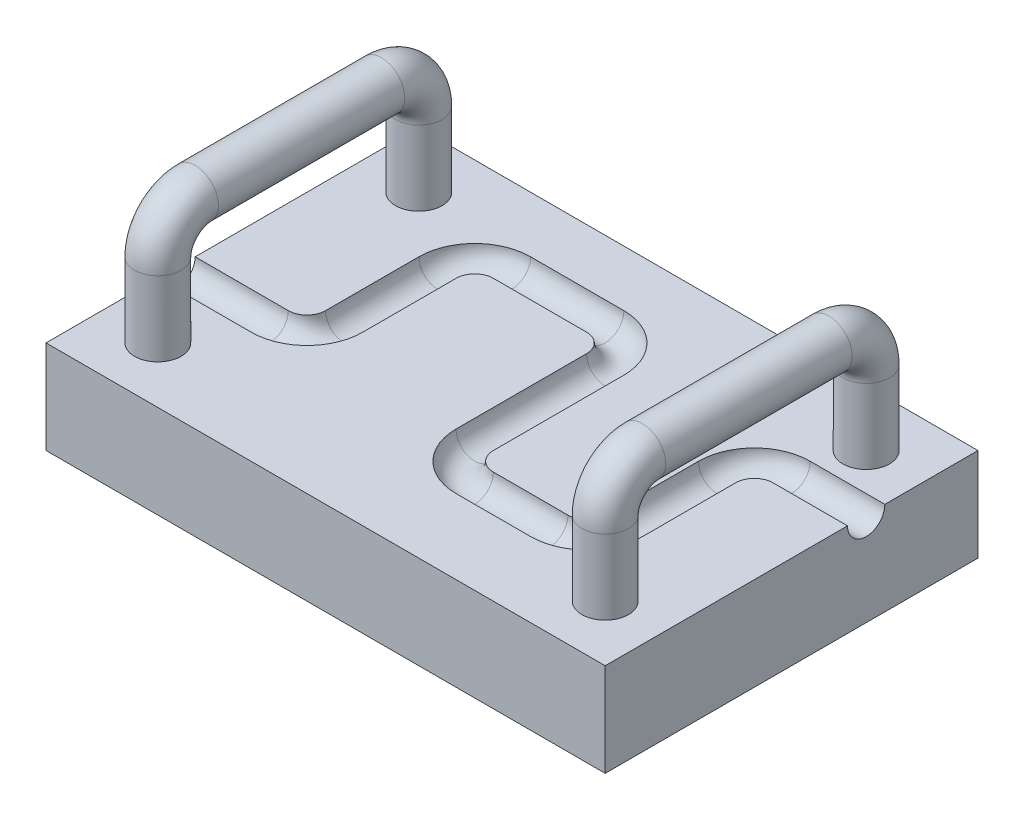
ISO-10303-21;
HEADER;
FILE_DESCRIPTION(('STEP AP214'),'2;1');
FILE_NAME('part.step','',(''),(''),'','','');
FILE_SCHEMA(('AUTOMOTIVE_DESIGN { 1 0 10303 214 1 1 1 1 }'));
ENDSEC;
DATA;
#1=APPLICATION_CONTEXT('core data for automotive mechanical design processes');
#2=APPLICATION_PROTOCOL_DEFINITION('international standard','automotive_design',2000,#1);
#3=PRODUCT_CONTEXT('',#1,'mechanical');
#4=PRODUCT('Part','Part','',(#3));
#5=PRODUCT_RELATED_PRODUCT_CATEGORY('part','',(#4));
#6=PRODUCT_DEFINITION_FORMATION('','',#4);
#7=PRODUCT_DEFINITION_CONTEXT('part definition',#1,'design');
#8=PRODUCT_DEFINITION('design','',#6,#7);
#9=PRODUCT_DEFINITION_SHAPE('','',#8);
#10=(LENGTH_UNIT() NAMED_UNIT(*) SI_UNIT(.MILLI.,.METRE.));
#11=(NAMED_UNIT(*) PLANE_ANGLE_UNIT() SI_UNIT($,.RADIAN.));
#12=(NAMED_UNIT(*) SI_UNIT($,.STERADIAN.) SOLID_ANGLE_UNIT());
#13=UNCERTAINTY_MEASURE_WITH_UNIT(LENGTH_MEASURE(1.E-05),#10,'distance_accuracy_value','');
#14=(GEOMETRIC_REPRESENTATION_CONTEXT(3) GLOBAL_UNCERTAINTY_ASSIGNED_CONTEXT((#13)) GLOBAL_UNIT_ASSIGNED_CONTEXT((#10,
#11,#12)) REPRESENTATION_CONTEXT('',''));
#15=CARTESIAN_POINT('',(0.,0.,0.));
#16=DIRECTION('',(0.,0.,1.));
#17=DIRECTION('',(1.,0.,0.));
#18=AXIS2_PLACEMENT_3D('',#15,#16,#17);
#19=CARTESIAN_POINT('',(0.,50.,0.));
#20=DIRECTION('',(0.,-1.,0.));
#21=DIRECTION('',(0.,0.,-1.));
#22=AXIS2_PLACEMENT_3D('',#19,#20,#21);
#23=PLANE('',#22);
#24=CARTESIAN_POINT('',(120.,50.,70.));
#25=DIRECTION('',(0.,1.,0.));
#26=DIRECTION('',(0.,0.,-1.));
#27=AXIS2_PLACEMENT_3D('',#24,#25,#26);
#28=CIRCLE('',#27,12.5);
#29=CARTESIAN_POINT('',(120.,50.,57.5));
#30=VERTEX_POINT('',#29);
#31=EDGE_CURVE('E517',#30,#30,#28,.F.);
#32=ORIENTED_EDGE('',*,*,#31,.T.);
#33=EDGE_LOOP('',(#32));
#34=FACE_BOUND('',#33,.T.);
#35=CARTESIAN_POINT('',(-120.,50.,70.));
#36=DIRECTION('',(0.,-1.,0.));
#37=DIRECTION('',(0.,0.,-1.));
#38=AXIS2_PLACEMENT_3D('',#35,#36,#37);
#39=CIRCLE('',#38,12.5);
#40=CARTESIAN_POINT('',(-120.,50.,57.5));
#41=VERTEX_POINT('',#40);
#42=EDGE_CURVE('E540',#41,#41,#39,.T.);
#43=ORIENTED_EDGE('',*,*,#42,.T.);
#44=EDGE_LOOP('',(#43));
#45=FACE_BOUND('',#44,.T.);
#46=DIRECTION('',(-1.,0.,0.));
#47=VECTOR('',#46,1.);
#48=CARTESIAN_POINT('',(151.,50.,-30.));
#49=LINE('',#48,#47);
#50=CARTESIAN_POINT('',(110.,50.,-30.));
#51=VERTEX_POINT('',#50);
#52=CARTESIAN_POINT('',(150.,50.,-30.));
#53=VERTEX_POINT('',#52);
#54=EDGE_CURVE('E12',#51,#53,#49,.F.);
#55=ORIENTED_EDGE('',*,*,#54,.F.);
#56=CARTESIAN_POINT('',(110.,50.,-20.));
#57=DIRECTION('',(0.,1.,0.));
#58=DIRECTION('',(0.,0.,1.));
#59=AXIS2_PLACEMENT_3D('',#56,#57,#58);
#60=CIRCLE('',#59,9.99999999999883);
#61=CARTESIAN_POINT('',(100.,50.,-19.9999999999999));
#62=VERTEX_POINT('',#61);
#63=EDGE_CURVE('E62',#62,#51,#60,.F.);
#64=ORIENTED_EDGE('',*,*,#63,.F.);
#65=DIRECTION('',(0.,0.,1.));
#66=VECTOR('',#65,1.);
#67=CARTESIAN_POINT('',(100.,50.,-19.9999999999999));
#68=LINE('',#67,#66);
#69=CARTESIAN_POINT('',(100.,50.,29.9999999999998));
#70=VERTEX_POINT('',#69);
#71=EDGE_CURVE('E312',#70,#62,#68,.F.);
#72=ORIENTED_EDGE('',*,*,#71,.F.);
#73=CARTESIAN_POINT('',(70.,50.,30.));
#74=DIRECTION('',(0.,-1.,0.));
#75=DIRECTION('',(0.,0.,-1.));
#76=AXIS2_PLACEMENT_3D('',#73,#74,#75);
#77=CIRCLE('',#76,30.);
#78=CARTESIAN_POINT('',(70.0000000000001,50.,60.000000000001));
#79=VERTEX_POINT('',#78);
#80=EDGE_CURVE('E309',#79,#70,#77,.F.);
#81=ORIENTED_EDGE('',*,*,#80,.F.);
#82=DIRECTION('',(-1.,0.,0.));
#83=VECTOR('',#82,1.);
#84=CARTESIAN_POINT('',(69.9999999999999,50.,60.));
#85=LINE('',#84,#83);
#86=CARTESIAN_POINT('',(30.0000000000002,50.,59.9999999999995));
#87=VERTEX_POINT('',#86);
#88=EDGE_CURVE('E306',#87,#79,#85,.F.);
#89=ORIENTED_EDGE('',*,*,#88,.F.);
#90=CARTESIAN_POINT('',(30.,50.,30.));
#91=DIRECTION('',(0.,-1.,0.));
#92=DIRECTION('',(0.,0.,-1.));
#93=AXIS2_PLACEMENT_3D('',#90,#91,#92);
#94=CIRCLE('',#93,29.9999999999989);
#95=CARTESIAN_POINT('',(0.,50.,29.9999999999998));
#96=VERTEX_POINT('',#95);
#97=EDGE_CURVE('E303',#96,#87,#94,.F.);
#98=ORIENTED_EDGE('',*,*,#97,.F.);
#99=DIRECTION('',(0.,0.,-1.));
#100=VECTOR('',#99,1.);
#101=CARTESIAN_POINT('',(0.,50.,29.9999999999999));
#102=LINE('',#101,#100);
#103=CARTESIAN_POINT('',(0.,50.,-39.9999999999998));
#104=VERTEX_POINT('',#103);
#105=EDGE_CURVE('E300',#104,#96,#102,.F.);
#106=ORIENTED_EDGE('',*,*,#105,.F.);
#107=CARTESIAN_POINT('',(-9.99999999999999,50.,-40.));
#108=DIRECTION('',(0.,1.,0.));
#109=DIRECTION('',(0.,0.,1.));
#110=AXIS2_PLACEMENT_3D('',#107,#108,#109);
#111=CIRCLE('',#110,10.);
#112=CARTESIAN_POINT('',(-10.0000000000003,50.,-50.000000000001));
#113=VERTEX_POINT('',#112);
#114=EDGE_CURVE('E297',#113,#104,#111,.F.);
#115=ORIENTED_EDGE('',*,*,#114,.F.);
#116=DIRECTION('',(-1.,0.,0.));
#117=VECTOR('',#116,1.);
#118=CARTESIAN_POINT('',(-10.0000000000001,50.,-50.));
#119=LINE('',#118,#117);
#120=CARTESIAN_POINT('',(-59.9999999999998,50.,-50.));
#121=VERTEX_POINT('',#120);
#122=EDGE_CURVE('E294',#121,#113,#119,.F.);
#123=ORIENTED_EDGE('',*,*,#122,.F.);
#124=CARTESIAN_POINT('',(-60.,50.,-40.));
#125=DIRECTION('',(0.,1.,0.));
#126=DIRECTION('',(0.,0.,1.));
#127=AXIS2_PLACEMENT_3D('',#124,#125,#126);
#128=CIRCLE('',#127,9.99999999999894);
#129=CARTESIAN_POINT('',(-70.,50.,-39.9999999999999));
#130=VERTEX_POINT('',#129);
#131=EDGE_CURVE('E291',#130,#121,#128,.F.);
#132=ORIENTED_EDGE('',*,*,#131,.F.);
#133=DIRECTION('',(0.,0.,1.));
#134=VECTOR('',#133,1.);
#135=CARTESIAN_POINT('',(-70.,50.,-39.9999999999999));
#136=LINE('',#135,#134);
#137=CARTESIAN_POINT('',(-70.,50.,9.99999999999985));
#138=VERTEX_POINT('',#137);
#139=EDGE_CURVE('E288',#138,#130,#136,.F.);
#140=ORIENTED_EDGE('',*,*,#139,.F.);
#141=CARTESIAN_POINT('',(-100.,50.,10.));
#142=DIRECTION('',(0.,-1.,0.));
#143=DIRECTION('',(0.,0.,-1.));
#144=AXIS2_PLACEMENT_3D('',#141,#142,#143);
#145=CIRCLE('',#144,30.);
#146=CARTESIAN_POINT('',(-99.9999999999999,50.,40.0000000000012));
#147=VERTEX_POINT('',#146);
#148=EDGE_CURVE('E285',#147,#138,#145,.F.);
#149=ORIENTED_EDGE('',*,*,#148,.F.);
#150=DIRECTION('',(-1.,0.,0.));
#151=VECTOR('',#150,1.);
#152=CARTESIAN_POINT('',(-99.9999999999999,50.,40.0000000000012));
#153=LINE('',#152,#151);
#154=CARTESIAN_POINT('',(-150.,50.,40.0000000000012));
#155=VERTEX_POINT('',#154);
#156=EDGE_CURVE('E282',#155,#147,#153,.F.);
#157=ORIENTED_EDGE('',*,*,#156,.F.);
#158=DIRECTION('',(0.,0.,1.));
#159=VECTOR('',#158,1.);
#160=CARTESIAN_POINT('',(-150.,50.,100.));
#161=LINE('',#160,#159);
#162=CARTESIAN_POINT('',(-150.,50.,100.));
#163=VERTEX_POINT('',#162);
#164=EDGE_CURVE('E208',#155,#163,#161,.T.);
#165=ORIENTED_EDGE('',*,*,#164,.T.);
#166=DIRECTION('',(1.,0.,0.));
#167=VECTOR('',#166,1.);
#168=CARTESIAN_POINT('',(-150.,50.,100.));
#169=LINE('',#168,#167);
#170=CARTESIAN_POINT('',(150.,50.,100.));
#171=VERTEX_POINT('',#170);
#172=EDGE_CURVE('E78',#163,#171,#169,.T.);
#173=ORIENTED_EDGE('',*,*,#172,.T.);
#174=DIRECTION('',(0.,0.,-1.));
#175=VECTOR('',#174,1.);
#176=CARTESIAN_POINT('',(150.,50.,100.));
#177=LINE('',#176,#175);
#178=EDGE_CURVE('E197',#171,#53,#177,.T.);
#179=ORIENTED_EDGE('',*,*,#178,.T.);
#180=EDGE_LOOP('',(#55,#64,#72,#81,#89,#98,#106,#115,#123,#132,#140,#149,#157,#165,#173,#179));
#181=FACE_BOUND('',#180,.T.);
#182=ADVANCED_FACE('F53',(#34,#45,#181),#23,.F.);
#183=CARTESIAN_POINT('',(120.,50.,-70.));
#184=DIRECTION('',(0.,-1.,0.));
#185=DIRECTION('',(0.,0.,1.));
#186=AXIS2_PLACEMENT_3D('',#183,#184,#185);
#187=CIRCLE('',#186,12.5);
#188=CARTESIAN_POINT('',(120.,50.,-57.5));
#189=VERTEX_POINT('',#188);
#190=EDGE_CURVE('E499',#189,#189,#187,.F.);
#191=ORIENTED_EDGE('',*,*,#190,.F.);
#192=EDGE_LOOP('',(#191));
#193=FACE_BOUND('',#192,.T.);
#194=CARTESIAN_POINT('',(-120.,50.,-70.));
#195=DIRECTION('',(0.,1.,0.));
#196=DIRECTION('',(0.,0.,1.));
#197=AXIS2_PLACEMENT_3D('',#194,#195,#196);
#198=CIRCLE('',#197,12.5);
#199=CARTESIAN_POINT('',(-120.,50.,-57.5));
#200=VERTEX_POINT('',#199);
#201=EDGE_CURVE('E520',#200,#200,#198,.T.);
#202=ORIENTED_EDGE('',*,*,#201,.F.);
#203=EDGE_LOOP('',(#202));
#204=FACE_BOUND('',#203,.T.);
#205=DIRECTION('',(-1.,0.,0.));
#206=VECTOR('',#205,1.);
#207=CARTESIAN_POINT('',(151.,50.,-50.));
#208=LINE('',#207,#206);
#209=CARTESIAN_POINT('',(150.,50.,-50.));
#210=VERTEX_POINT('',#209);
#211=CARTESIAN_POINT('',(110.,50.,-49.9999999999994));
#212=VERTEX_POINT('',#211);
#213=EDGE_CURVE('E279',#210,#212,#208,.T.);
#214=ORIENTED_EDGE('',*,*,#213,.F.);
#215=CARTESIAN_POINT('',(150.,50.,-100.));
#216=VERTEX_POINT('',#215);
#217=EDGE_CURVE('E107',#210,#216,#177,.T.);
#218=ORIENTED_EDGE('',*,*,#217,.T.);
#219=DIRECTION('',(-1.,0.,0.));
#220=VECTOR('',#219,1.);
#221=CARTESIAN_POINT('',(-150.,50.,-100.));
#222=LINE('',#221,#220);
#223=CARTESIAN_POINT('',(-150.,50.,-100.));
#224=VERTEX_POINT('',#223);
#225=EDGE_CURVE('E204',#216,#224,#222,.T.);
#226=ORIENTED_EDGE('',*,*,#225,.T.);
#227=CARTESIAN_POINT('',(-150.,50.,20.0000000000012));
#228=VERTEX_POINT('',#227);
#229=EDGE_CURVE('E212',#224,#228,#161,.T.);
#230=ORIENTED_EDGE('',*,*,#229,.T.);
#231=DIRECTION('',(-1.,0.,0.));
#232=VECTOR('',#231,1.);
#233=CARTESIAN_POINT('',(-99.9999999999999,50.,20.0000000000012));
#234=LINE('',#233,#232);
#235=CARTESIAN_POINT('',(-99.9999999999999,50.,20.0000000000012));
#236=VERTEX_POINT('',#235);
#237=EDGE_CURVE('E243',#236,#228,#234,.T.);
#238=ORIENTED_EDGE('',*,*,#237,.F.);
#239=CARTESIAN_POINT('',(-100.,50.,10.));
#240=DIRECTION('',(0.,1.,0.));
#241=DIRECTION('',(0.,0.,1.));
#242=AXIS2_PLACEMENT_3D('',#239,#240,#241);
#243=CIRCLE('',#242,9.99999999999998);
#244=CARTESIAN_POINT('',(-90.,50.,9.99999999999984));
#245=VERTEX_POINT('',#244);
#246=EDGE_CURVE('E246',#245,#236,#243,.F.);
#247=ORIENTED_EDGE('',*,*,#246,.F.);
#248=DIRECTION('',(0.,0.,1.));
#249=VECTOR('',#248,1.);
#250=CARTESIAN_POINT('',(-90.,50.,-39.9999999999999));
#251=LINE('',#250,#249);
#252=CARTESIAN_POINT('',(-90.,50.,-39.9999999999998));
#253=VERTEX_POINT('',#252);
#254=EDGE_CURVE('E249',#253,#245,#251,.T.);
#255=ORIENTED_EDGE('',*,*,#254,.F.);
#256=CARTESIAN_POINT('',(-60.,50.,-40.));
#257=DIRECTION('',(0.,-1.,0.));
#258=DIRECTION('',(0.,0.,-1.));
#259=AXIS2_PLACEMENT_3D('',#256,#257,#258);
#260=CIRCLE('',#259,29.9999999999989);
#261=CARTESIAN_POINT('',(-59.9999999999998,50.,-69.9999999999994));
#262=VERTEX_POINT('',#261);
#263=EDGE_CURVE('E252',#262,#253,#260,.F.);
#264=ORIENTED_EDGE('',*,*,#263,.F.);
#265=DIRECTION('',(-1.,0.,0.));
#266=VECTOR('',#265,1.);
#267=CARTESIAN_POINT('',(-10.0000000000001,50.,-70.));
#268=LINE('',#267,#266);
#269=CARTESIAN_POINT('',(-10.0000000000003,50.,-70.000000000001));
#270=VERTEX_POINT('',#269);
#271=EDGE_CURVE('E255',#270,#262,#268,.T.);
#272=ORIENTED_EDGE('',*,*,#271,.F.);
#273=CARTESIAN_POINT('',(-9.99999999999999,50.,-40.));
#274=DIRECTION('',(0.,-1.,0.));
#275=DIRECTION('',(0.,0.,-1.));
#276=AXIS2_PLACEMENT_3D('',#273,#274,#275);
#277=CIRCLE('',#276,30.);
#278=CARTESIAN_POINT('',(20.,50.,-39.9999999999998));
#279=VERTEX_POINT('',#278);
#280=EDGE_CURVE('E258',#279,#270,#277,.F.);
#281=ORIENTED_EDGE('',*,*,#280,.F.);
#282=DIRECTION('',(0.,0.,-1.));
#283=VECTOR('',#282,1.);
#284=CARTESIAN_POINT('',(20.,50.,29.9999999999999));
#285=LINE('',#284,#283);
#286=CARTESIAN_POINT('',(20.,50.,29.9999999999999));
#287=VERTEX_POINT('',#286);
#288=EDGE_CURVE('E261',#287,#279,#285,.T.);
#289=ORIENTED_EDGE('',*,*,#288,.F.);
#290=CARTESIAN_POINT('',(30.,50.,30.));
#291=DIRECTION('',(0.,1.,0.));
#292=DIRECTION('',(0.,0.,1.));
#293=AXIS2_PLACEMENT_3D('',#290,#291,#292);
#294=CIRCLE('',#293,9.99999999999893);
#295=CARTESIAN_POINT('',(30.0000000000002,50.,40.));
#296=VERTEX_POINT('',#295);
#297=EDGE_CURVE('E264',#296,#287,#294,.F.);
#298=ORIENTED_EDGE('',*,*,#297,.F.);
#299=DIRECTION('',(-1.,0.,0.));
#300=VECTOR('',#299,1.);
#301=CARTESIAN_POINT('',(69.9999999999999,50.,40.));
#302=LINE('',#301,#300);
#303=CARTESIAN_POINT('',(70.0000000000001,50.,40.000000000001));
#304=VERTEX_POINT('',#303);
#305=EDGE_CURVE('E267',#304,#296,#302,.T.);
#306=ORIENTED_EDGE('',*,*,#305,.F.);
#307=CARTESIAN_POINT('',(70.,50.,30.));
#308=DIRECTION('',(0.,1.,0.));
#309=DIRECTION('',(0.,0.,1.));
#310=AXIS2_PLACEMENT_3D('',#307,#308,#309);
#311=CIRCLE('',#310,9.99999999999999);
#312=CARTESIAN_POINT('',(80.,50.,29.9999999999998));
#313=VERTEX_POINT('',#312);
#314=EDGE_CURVE('E270',#313,#304,#311,.F.);
#315=ORIENTED_EDGE('',*,*,#314,.F.);
#316=DIRECTION('',(0.,0.,1.));
#317=VECTOR('',#316,1.);
#318=CARTESIAN_POINT('',(80.,50.,-19.9999999999999));
#319=LINE('',#318,#317);
#320=CARTESIAN_POINT('',(80.,50.,-19.9999999999998));
#321=VERTEX_POINT('',#320);
#322=EDGE_CURVE('E273',#321,#313,#319,.T.);
#323=ORIENTED_EDGE('',*,*,#322,.F.);
#324=CARTESIAN_POINT('',(110.,50.,-20.));
#325=DIRECTION('',(0.,-1.,0.));
#326=DIRECTION('',(0.,0.,-1.));
#327=AXIS2_PLACEMENT_3D('',#324,#325,#326);
#328=CIRCLE('',#327,29.9999999999988);
#329=EDGE_CURVE('E276',#212,#321,#328,.F.);
#330=ORIENTED_EDGE('',*,*,#329,.F.);
#331=EDGE_LOOP('',(#214,#218,#226,#230,#238,#247,#255,#264,#272,#281,#289,#298,#306,#315,#323,#330));
#332=FACE_BOUND('',#331,.T.);
#333=ADVANCED_FACE('F380',(#193,#204,#332),#23,.F.);
#334=CARTESIAN_POINT('',(150.,50.,100.));
#335=DIRECTION('',(-1.,0.,0.));
#336=DIRECTION('',(0.,0.,1.));
#337=AXIS2_PLACEMENT_3D('',#334,#335,#336);
#338=PLANE('',#337);
#339=CARTESIAN_POINT('',(150.,50.,-40.));
#340=DIRECTION('',(-1.,0.,0.));
#341=DIRECTION('',(0.,0.,1.));
#342=AXIS2_PLACEMENT_3D('',#339,#340,#341);
#343=CIRCLE('',#342,10.);
#344=EDGE_CURVE('E191',#210,#53,#343,.T.);
#345=ORIENTED_EDGE('',*,*,#344,.T.);
#346=ORIENTED_EDGE('',*,*,#178,.F.);
#347=DIRECTION('',(0.,-1.,0.));
#348=VECTOR('',#347,1.);
#349=CARTESIAN_POINT('',(150.,50.,100.));
#350=LINE('',#349,#348);
#351=CARTESIAN_POINT('',(150.,0.,100.));
#352=VERTEX_POINT('',#351);
#353=EDGE_CURVE('E218',#171,#352,#350,.T.);
#354=ORIENTED_EDGE('',*,*,#353,.T.);
#355=DIRECTION('',(0.,0.,-1.));
#356=VECTOR('',#355,1.);
#357=CARTESIAN_POINT('',(150.,0.,100.));
#358=LINE('',#357,#356);
#359=CARTESIAN_POINT('',(150.,0.,-100.));
#360=VERTEX_POINT('',#359);
#361=EDGE_CURVE('E200',#352,#360,#358,.T.);
#362=ORIENTED_EDGE('',*,*,#361,.T.);
#363=DIRECTION('',(0.,-1.,0.));
#364=VECTOR('',#363,1.);
#365=CARTESIAN_POINT('',(150.,50.,-100.));
#366=LINE('',#365,#364);
#367=EDGE_CURVE('E239',#216,#360,#366,.T.);
#368=ORIENTED_EDGE('',*,*,#367,.F.);
#369=ORIENTED_EDGE('',*,*,#217,.F.);
#370=EDGE_LOOP('',(#345,#346,#354,#362,#368,#369));
#371=FACE_BOUND('',#370,.T.);
#372=ADVANCED_FACE('F55',(#371),#338,.F.);
#373=CARTESIAN_POINT('',(-150.,50.,-100.));
#374=DIRECTION('',(0.,0.,1.));
#375=DIRECTION('',(1.,0.,0.));
#376=AXIS2_PLACEMENT_3D('',#373,#374,#375);
#377=PLANE('',#376);
#378=DIRECTION('',(-1.,0.,0.));
#379=VECTOR('',#378,1.);
#380=CARTESIAN_POINT('',(-150.,0.,-100.));
#381=LINE('',#380,#379);
#382=CARTESIAN_POINT('',(-150.,0.,-100.));
#383=VERTEX_POINT('',#382);
#384=EDGE_CURVE('E222',#360,#383,#381,.T.);
#385=ORIENTED_EDGE('',*,*,#384,.T.);
#386=DIRECTION('',(0.,-1.,0.));
#387=VECTOR('',#386,1.);
#388=CARTESIAN_POINT('',(-150.,50.,-100.));
#389=LINE('',#388,#387);
#390=EDGE_CURVE('E235',#224,#383,#389,.T.);
#391=ORIENTED_EDGE('',*,*,#390,.F.);
#392=ORIENTED_EDGE('',*,*,#225,.F.);
#393=ORIENTED_EDGE('',*,*,#367,.T.);
#394=EDGE_LOOP('',(#385,#391,#392,#393));
#395=FACE_BOUND('',#394,.T.);
#396=ADVANCED_FACE('F384',(#395),#377,.F.);
#397=CARTESIAN_POINT('',(-150.,50.,100.));
#398=DIRECTION('',(1.,0.,0.));
#399=DIRECTION('',(0.,0.,-1.));
#400=AXIS2_PLACEMENT_3D('',#397,#398,#399);
#401=PLANE('',#400);
#402=CARTESIAN_POINT('',(-150.,50.,30.0000000000012));
#403=DIRECTION('',(1.,0.,0.));
#404=DIRECTION('',(0.,0.,-1.));
#405=AXIS2_PLACEMENT_3D('',#402,#403,#404);
#406=CIRCLE('',#405,10.);
#407=EDGE_CURVE('E201',#155,#228,#406,.T.);
#408=ORIENTED_EDGE('',*,*,#407,.T.);
#409=ORIENTED_EDGE('',*,*,#229,.F.);
#410=ORIENTED_EDGE('',*,*,#390,.T.);
#411=DIRECTION('',(0.,0.,1.));
#412=VECTOR('',#411,1.);
#413=CARTESIAN_POINT('',(-150.,0.,100.));
#414=LINE('',#413,#412);
#415=CARTESIAN_POINT('',(-150.,0.,100.));
#416=VERTEX_POINT('',#415);
#417=EDGE_CURVE('E225',#383,#416,#414,.T.);
#418=ORIENTED_EDGE('',*,*,#417,.T.);
#419=DIRECTION('',(0.,-1.,0.));
#420=VECTOR('',#419,1.);
#421=CARTESIAN_POINT('',(-150.,50.,100.));
#422=LINE('',#421,#420);
#423=EDGE_CURVE('E232',#163,#416,#422,.T.);
#424=ORIENTED_EDGE('',*,*,#423,.F.);
#425=ORIENTED_EDGE('',*,*,#164,.F.);
#426=EDGE_LOOP('',(#408,#409,#410,#418,#424,#425));
#427=FACE_BOUND('',#426,.T.);
#428=ADVANCED_FACE('F376',(#427),#401,.F.);
#429=CARTESIAN_POINT('',(-150.,50.,100.));
#430=DIRECTION('',(0.,0.,-1.));
#431=DIRECTION('',(-1.,0.,0.));
#432=AXIS2_PLACEMENT_3D('',#429,#430,#431);
#433=PLANE('',#432);
#434=DIRECTION('',(1.,0.,0.));
#435=VECTOR('',#434,1.);
#436=CARTESIAN_POINT('',(-150.,0.,100.));
#437=LINE('',#436,#435);
#438=EDGE_CURVE('E99',#416,#352,#437,.T.);
#439=ORIENTED_EDGE('',*,*,#438,.T.);
#440=ORIENTED_EDGE('',*,*,#353,.F.);
#441=ORIENTED_EDGE('',*,*,#172,.F.);
#442=ORIENTED_EDGE('',*,*,#423,.T.);
#443=EDGE_LOOP('',(#439,#440,#441,#442));
#444=FACE_BOUND('',#443,.T.);
#445=ADVANCED_FACE('F389',(#444),#433,.F.);
#446=CARTESIAN_POINT('',(0.,0.,0.));
#447=DIRECTION('',(0.,-1.,0.));
#448=DIRECTION('',(0.,0.,-1.));
#449=AXIS2_PLACEMENT_3D('',#446,#447,#448);
#450=PLANE('',#449);
#451=ORIENTED_EDGE('',*,*,#361,.F.);
#452=ORIENTED_EDGE('',*,*,#438,.F.);
#453=ORIENTED_EDGE('',*,*,#417,.F.);
#454=ORIENTED_EDGE('',*,*,#384,.F.);
#455=EDGE_LOOP('',(#451,#452,#453,#454));
#456=FACE_BOUND('',#455,.T.);
#457=ADVANCED_FACE('F388',(#456),#450,.T.);
#458=CARTESIAN_POINT('',(151.,50.,-40.));
#459=DIRECTION('',(-1.,0.,0.));
#460=DIRECTION('',(0.,0.,1.));
#461=AXIS2_PLACEMENT_3D('',#458,#459,#460);
#462=CYLINDRICAL_SURFACE('',#461,10.);
#463=ORIENTED_EDGE('',*,*,#54,.T.);
#464=ORIENTED_EDGE('',*,*,#344,.F.);
#465=ORIENTED_EDGE('',*,*,#213,.T.);
#466=CARTESIAN_POINT('',(110.,50.,-40.));
#467=DIRECTION('',(1.,0.,0.));
#468=DIRECTION('',(0.,0.,-1.));
#469=AXIS2_PLACEMENT_3D('',#466,#467,#468);
#470=CIRCLE('',#469,10.);
#471=EDGE_CURVE('E193',#51,#212,#470,.T.);
#472=ORIENTED_EDGE('',*,*,#471,.F.);
#473=EDGE_LOOP('',(#463,#464,#465,#472));
#474=FACE_BOUND('',#473,.T.);
#475=ADVANCED_FACE('F190',(#474),#462,.F.);
#476=CARTESIAN_POINT('',(110.,50.,-20.));
#477=DIRECTION('',(0.,1.,0.));
#478=DIRECTION('',(0.,0.,1.));
#479=AXIS2_PLACEMENT_3D('',#476,#477,#478);
#480=TOROIDAL_SURFACE('',#479,19.9999999999988,10.);
#481=ORIENTED_EDGE('',*,*,#329,.T.);
#482=CARTESIAN_POINT('',(90.,50.,-19.9999999999999));
#483=DIRECTION('',(0.,0.,-1.));
#484=DIRECTION('',(-1.,0.,0.));
#485=AXIS2_PLACEMENT_3D('',#482,#483,#484);
#486=CIRCLE('',#485,10.);
#487=EDGE_CURVE('E320',#62,#321,#486,.T.);
#488=ORIENTED_EDGE('',*,*,#487,.F.);
#489=ORIENTED_EDGE('',*,*,#63,.T.);
#490=ORIENTED_EDGE('',*,*,#471,.T.);
#491=EDGE_LOOP('',(#481,#488,#489,#490));
#492=FACE_BOUND('',#491,.T.);
#493=ADVANCED_FACE('F317',(#492),#480,.F.);
#494=CARTESIAN_POINT('',(90.,50.,-19.9999999999999));
#495=DIRECTION('',(0.,0.,1.));
#496=DIRECTION('',(1.,0.,0.));
#497=AXIS2_PLACEMENT_3D('',#494,#495,#496);
#498=CYLINDRICAL_SURFACE('',#497,10.);
#499=ORIENTED_EDGE('',*,*,#71,.T.);
#500=ORIENTED_EDGE('',*,*,#487,.T.);
#501=ORIENTED_EDGE('',*,*,#322,.T.);
#502=CARTESIAN_POINT('',(90.,50.,29.9999999999998));
#503=DIRECTION('',(0.,0.,-1.));
#504=DIRECTION('',(-1.,0.,0.));
#505=AXIS2_PLACEMENT_3D('',#502,#503,#504);
#506=CIRCLE('',#505,10.);
#507=EDGE_CURVE('E329',#70,#313,#506,.T.);
#508=ORIENTED_EDGE('',*,*,#507,.F.);
#509=EDGE_LOOP('',(#499,#500,#501,#508));
#510=FACE_BOUND('',#509,.T.);
#511=ADVANCED_FACE('F326',(#510),#498,.F.);
#512=CARTESIAN_POINT('',(70.,50.,30.));
#513=DIRECTION('',(0.,-1.,0.));
#514=DIRECTION('',(0.,0.,-1.));
#515=AXIS2_PLACEMENT_3D('',#512,#513,#514);
#516=TOROIDAL_SURFACE('',#515,20.,10.);
#517=ORIENTED_EDGE('',*,*,#80,.T.);
#518=ORIENTED_EDGE('',*,*,#507,.T.);
#519=ORIENTED_EDGE('',*,*,#314,.T.);
#520=CARTESIAN_POINT('',(70.0000000000001,50.,50.000000000001));
#521=DIRECTION('',(1.,0.,0.));
#522=DIRECTION('',(0.,0.,-1.));
#523=AXIS2_PLACEMENT_3D('',#520,#521,#522);
#524=CIRCLE('',#523,10.);
#525=EDGE_CURVE('E333',#79,#304,#524,.T.);
#526=ORIENTED_EDGE('',*,*,#525,.F.);
#527=EDGE_LOOP('',(#517,#518,#519,#526));
#528=FACE_BOUND('',#527,.T.);
#529=ADVANCED_FACE('F444',(#528),#516,.F.);
#530=CARTESIAN_POINT('',(69.9999999999999,50.,50.));
#531=DIRECTION('',(-1.,0.,0.));
#532=DIRECTION('',(0.,0.,1.));
#533=AXIS2_PLACEMENT_3D('',#530,#531,#532);
#534=CYLINDRICAL_SURFACE('',#533,10.);
#535=ORIENTED_EDGE('',*,*,#88,.T.);
#536=ORIENTED_EDGE('',*,*,#525,.T.);
#537=ORIENTED_EDGE('',*,*,#305,.T.);
#538=CARTESIAN_POINT('',(30.0000000000002,50.,50.));
#539=DIRECTION('',(1.,0.,0.));
#540=DIRECTION('',(0.,0.,-1.));
#541=AXIS2_PLACEMENT_3D('',#538,#539,#540);
#542=CIRCLE('',#541,10.);
#543=EDGE_CURVE('E338',#87,#296,#542,.T.);
#544=ORIENTED_EDGE('',*,*,#543,.F.);
#545=EDGE_LOOP('',(#535,#536,#537,#544));
#546=FACE_BOUND('',#545,.T.);
#547=ADVANCED_FACE('F440',(#546),#534,.F.);
#548=CARTESIAN_POINT('',(30.,50.,30.));
#549=DIRECTION('',(0.,-1.,0.));
#550=DIRECTION('',(0.,0.,-1.));
#551=AXIS2_PLACEMENT_3D('',#548,#549,#550);
#552=TOROIDAL_SURFACE('',#551,19.9999999999989,10.);
#553=ORIENTED_EDGE('',*,*,#97,.T.);
#554=ORIENTED_EDGE('',*,*,#543,.T.);
#555=ORIENTED_EDGE('',*,*,#297,.T.);
#556=CARTESIAN_POINT('',(10.,50.,29.9999999999999));
#557=DIRECTION('',(0.,0.,1.));
#558=DIRECTION('',(1.,0.,0.));
#559=AXIS2_PLACEMENT_3D('',#556,#557,#558);
#560=CIRCLE('',#559,10.);
#561=EDGE_CURVE('E346',#96,#287,#560,.T.);
#562=ORIENTED_EDGE('',*,*,#561,.F.);
#563=EDGE_LOOP('',(#553,#554,#555,#562));
#564=FACE_BOUND('',#563,.T.);
#565=ADVANCED_FACE('F436',(#564),#552,.F.);
#566=CARTESIAN_POINT('',(10.,50.,29.9999999999999));
#567=DIRECTION('',(0.,0.,-1.));
#568=DIRECTION('',(-1.,0.,0.));
#569=AXIS2_PLACEMENT_3D('',#566,#567,#568);
#570=CYLINDRICAL_SURFACE('',#569,10.);
#571=ORIENTED_EDGE('',*,*,#105,.T.);
#572=ORIENTED_EDGE('',*,*,#561,.T.);
#573=ORIENTED_EDGE('',*,*,#288,.T.);
#574=CARTESIAN_POINT('',(10.,50.,-39.9999999999998));
#575=DIRECTION('',(0.,0.,1.));
#576=DIRECTION('',(1.,0.,0.));
#577=AXIS2_PLACEMENT_3D('',#574,#575,#576);
#578=CIRCLE('',#577,10.);
#579=EDGE_CURVE('E350',#104,#279,#578,.T.);
#580=ORIENTED_EDGE('',*,*,#579,.F.);
#581=EDGE_LOOP('',(#571,#572,#573,#580));
#582=FACE_BOUND('',#581,.T.);
#583=ADVANCED_FACE('F432',(#582),#570,.F.);
#584=CARTESIAN_POINT('',(-9.99999999999999,50.,-40.));
#585=DIRECTION('',(0.,1.,0.));
#586=DIRECTION('',(0.,0.,1.));
#587=AXIS2_PLACEMENT_3D('',#584,#585,#586);
#588=TOROIDAL_SURFACE('',#587,20.,10.);
#589=ORIENTED_EDGE('',*,*,#280,.T.);
#590=CARTESIAN_POINT('',(-10.0000000000003,50.,-60.000000000001));
#591=DIRECTION('',(1.,0.,0.));
#592=DIRECTION('',(0.,0.,-1.));
#593=AXIS2_PLACEMENT_3D('',#590,#591,#592);
#594=CIRCLE('',#593,10.);
#595=EDGE_CURVE('E354',#113,#270,#594,.T.);
#596=ORIENTED_EDGE('',*,*,#595,.F.);
#597=ORIENTED_EDGE('',*,*,#114,.T.);
#598=ORIENTED_EDGE('',*,*,#579,.T.);
#599=EDGE_LOOP('',(#589,#596,#597,#598));
#600=FACE_BOUND('',#599,.T.);
#601=ADVANCED_FACE('F428',(#600),#588,.F.);
#602=CARTESIAN_POINT('',(-10.0000000000001,50.,-60.));
#603=DIRECTION('',(-1.,0.,0.));
#604=DIRECTION('',(0.,0.,1.));
#605=AXIS2_PLACEMENT_3D('',#602,#603,#604);
#606=CYLINDRICAL_SURFACE('',#605,10.);
#607=ORIENTED_EDGE('',*,*,#122,.T.);
#608=ORIENTED_EDGE('',*,*,#595,.T.);
#609=ORIENTED_EDGE('',*,*,#271,.T.);
#610=CARTESIAN_POINT('',(-59.9999999999998,50.,-60.));
#611=DIRECTION('',(1.,0.,0.));
#612=DIRECTION('',(0.,0.,-1.));
#613=AXIS2_PLACEMENT_3D('',#610,#611,#612);
#614=CIRCLE('',#613,10.);
#615=EDGE_CURVE('E358',#121,#262,#614,.T.);
#616=ORIENTED_EDGE('',*,*,#615,.F.);
#617=EDGE_LOOP('',(#607,#608,#609,#616));
#618=FACE_BOUND('',#617,.T.);
#619=ADVANCED_FACE('F424',(#618),#606,.F.);
#620=CARTESIAN_POINT('',(-60.,50.,-40.));
#621=DIRECTION('',(0.,1.,0.));
#622=DIRECTION('',(0.,0.,1.));
#623=AXIS2_PLACEMENT_3D('',#620,#621,#622);
#624=TOROIDAL_SURFACE('',#623,19.9999999999989,10.);
#625=ORIENTED_EDGE('',*,*,#263,.T.);
#626=CARTESIAN_POINT('',(-80.,50.,-39.9999999999999));
#627=DIRECTION('',(0.,0.,-1.));
#628=DIRECTION('',(-1.,0.,0.));
#629=AXIS2_PLACEMENT_3D('',#626,#627,#628);
#630=CIRCLE('',#629,10.);
#631=EDGE_CURVE('E362',#130,#253,#630,.T.);
#632=ORIENTED_EDGE('',*,*,#631,.F.);
#633=ORIENTED_EDGE('',*,*,#131,.T.);
#634=ORIENTED_EDGE('',*,*,#615,.T.);
#635=EDGE_LOOP('',(#625,#632,#633,#634));
#636=FACE_BOUND('',#635,.T.);
#637=ADVANCED_FACE('F420',(#636),#624,.F.);
#638=CARTESIAN_POINT('',(-80.,50.,-39.9999999999999));
#639=DIRECTION('',(0.,0.,1.));
#640=DIRECTION('',(1.,0.,0.));
#641=AXIS2_PLACEMENT_3D('',#638,#639,#640);
#642=CYLINDRICAL_SURFACE('',#641,10.);
#643=ORIENTED_EDGE('',*,*,#139,.T.);
#644=ORIENTED_EDGE('',*,*,#631,.T.);
#645=ORIENTED_EDGE('',*,*,#254,.T.);
#646=CARTESIAN_POINT('',(-80.,50.,9.99999999999984));
#647=DIRECTION('',(0.,0.,-1.));
#648=DIRECTION('',(-1.,0.,0.));
#649=AXIS2_PLACEMENT_3D('',#646,#647,#648);
#650=CIRCLE('',#649,10.);
#651=EDGE_CURVE('E366',#138,#245,#650,.T.);
#652=ORIENTED_EDGE('',*,*,#651,.F.);
#653=EDGE_LOOP('',(#643,#644,#645,#652));
#654=FACE_BOUND('',#653,.T.);
#655=ADVANCED_FACE('F416',(#654),#642,.F.);
#656=CARTESIAN_POINT('',(-100.,50.,10.));
#657=DIRECTION('',(0.,-1.,0.));
#658=DIRECTION('',(0.,0.,-1.));
#659=AXIS2_PLACEMENT_3D('',#656,#657,#658);
#660=TOROIDAL_SURFACE('',#659,20.,10.);
#661=ORIENTED_EDGE('',*,*,#148,.T.);
#662=ORIENTED_EDGE('',*,*,#651,.T.);
#663=ORIENTED_EDGE('',*,*,#246,.T.);
#664=CARTESIAN_POINT('',(-99.9999999999999,50.,30.0000000000012));
#665=DIRECTION('',(1.,0.,0.));
#666=DIRECTION('',(0.,0.,-1.));
#667=AXIS2_PLACEMENT_3D('',#664,#665,#666);
#668=CIRCLE('',#667,10.);
#669=EDGE_CURVE('E69',#147,#236,#668,.T.);
#670=ORIENTED_EDGE('',*,*,#669,.F.);
#671=EDGE_LOOP('',(#661,#662,#663,#670));
#672=FACE_BOUND('',#671,.T.);
#673=ADVANCED_FACE('F412',(#672),#660,.F.);
#674=CARTESIAN_POINT('',(-99.9999999999999,50.,30.0000000000012));
#675=DIRECTION('',(-1.,0.,0.));
#676=DIRECTION('',(0.,0.,1.));
#677=AXIS2_PLACEMENT_3D('',#674,#675,#676);
#678=CYLINDRICAL_SURFACE('',#677,10.);
#679=ORIENTED_EDGE('',*,*,#156,.T.);
#680=ORIENTED_EDGE('',*,*,#669,.T.);
#681=ORIENTED_EDGE('',*,*,#237,.T.);
#682=ORIENTED_EDGE('',*,*,#407,.F.);
#683=EDGE_LOOP('',(#679,#680,#681,#682));
#684=FACE_BOUND('',#683,.T.);
#685=ADVANCED_FACE('F408',(#684),#678,.F.);
#686=CARTESIAN_POINT('',(-120.,50.,-70.));
#687=DIRECTION('',(0.,1.,0.));
#688=DIRECTION('',(0.,0.,1.));
#689=AXIS2_PLACEMENT_3D('',#686,#687,#688);
#690=CYLINDRICAL_SURFACE('',#689,12.5);
#691=CARTESIAN_POINT('',(-120.,90.,-70.));
#692=DIRECTION('',(0.,1.,0.));
#693=DIRECTION('',(0.,0.,1.));
#694=AXIS2_PLACEMENT_3D('',#691,#692,#693);
#695=CIRCLE('',#694,12.5);
#696=CARTESIAN_POINT('',(-120.,90.,-82.5));
#697=VERTEX_POINT('',#696);
#698=EDGE_CURVE('E524',#697,#697,#695,.T.);
#699=ORIENTED_EDGE('',*,*,#698,.F.);
#700=EDGE_LOOP('',(#699));
#701=FACE_BOUND('',#700,.T.);
#702=ORIENTED_EDGE('',*,*,#201,.T.);
#703=EDGE_LOOP('',(#702));
#704=FACE_BOUND('',#703,.T.);
#705=ADVANCED_FACE('F411',(#701,#704),#690,.T.);
#706=CARTESIAN_POINT('',(-120.,90.,-50.));
#707=DIRECTION('',(1.,0.,0.));
#708=DIRECTION('',(0.,0.,-1.));
#709=AXIS2_PLACEMENT_3D('',#706,#707,#708);
#710=TOROIDAL_SURFACE('',#709,20.,12.5);
#711=CARTESIAN_POINT('',(-120.,110.,-50.));
#712=DIRECTION('',(0.,0.,1.));
#713=DIRECTION('',(0.,-1.,0.));
#714=AXIS2_PLACEMENT_3D('',#711,#712,#713);
#715=CIRCLE('',#714,12.5);
#716=CARTESIAN_POINT('',(-120.,122.5,-50.));
#717=VERTEX_POINT('',#716);
#718=EDGE_CURVE('E528',#717,#717,#715,.T.);
#719=CARTESIAN_POINT('',(-120.,90.,-50.));
#720=DIRECTION('',(1.,0.,0.));
#721=DIRECTION('',(0.,0.,-1.));
#722=AXIS2_PLACEMENT_3D('',#719,#720,#721);
#723=CIRCLE('',#722,32.5);
#724=EDGE_CURVE('',#697,#717,#723,.T.);
#725=ORIENTED_EDGE('',*,*,#698,.T.);
#726=ORIENTED_EDGE('',*,*,#718,.F.);
#727=ORIENTED_EDGE('',*,*,#724,.T.);
#728=ORIENTED_EDGE('',*,*,#724,.F.);
#729=EDGE_LOOP('',(#725,#727,#726,#728));
#730=FACE_BOUND('',#729,.T.);
#731=ADVANCED_FACE('F465',(#730),#710,.T.);
#732=CARTESIAN_POINT('',(-120.,110.,-50.));
#733=DIRECTION('',(0.,0.,1.));
#734=DIRECTION('',(1.,0.,0.));
#735=AXIS2_PLACEMENT_3D('',#732,#733,#734);
#736=CYLINDRICAL_SURFACE('',#735,12.5);
#737=CARTESIAN_POINT('',(-120.,110.,50.));
#738=DIRECTION('',(0.,0.,1.));
#739=DIRECTION('',(0.,-1.,0.));
#740=AXIS2_PLACEMENT_3D('',#737,#738,#739);
#741=CIRCLE('',#740,12.5);
#742=CARTESIAN_POINT('',(-120.,122.5,50.));
#743=VERTEX_POINT('',#742);
#744=EDGE_CURVE('E532',#743,#743,#741,.T.);
#745=ORIENTED_EDGE('',*,*,#744,.F.);
#746=EDGE_LOOP('',(#745));
#747=FACE_BOUND('',#746,.T.);
#748=ORIENTED_EDGE('',*,*,#718,.T.);
#749=EDGE_LOOP('',(#748));
#750=FACE_BOUND('',#749,.T.);
#751=ADVANCED_FACE('F461',(#747,#750),#736,.T.);
#752=CARTESIAN_POINT('',(-120.,90.,50.));
#753=DIRECTION('',(1.,0.,0.));
#754=DIRECTION('',(0.,0.,-1.));
#755=AXIS2_PLACEMENT_3D('',#752,#753,#754);
#756=TOROIDAL_SURFACE('',#755,20.,12.5);
#757=CARTESIAN_POINT('',(-120.,90.,70.));
#758=DIRECTION('',(0.,-1.,0.));
#759=DIRECTION('',(0.,0.,-1.));
#760=AXIS2_PLACEMENT_3D('',#757,#758,#759);
#761=CIRCLE('',#760,12.5);
#762=CARTESIAN_POINT('',(-120.,90.,82.5));
#763=VERTEX_POINT('',#762);
#764=EDGE_CURVE('E536',#763,#763,#761,.T.);
#765=CARTESIAN_POINT('',(-120.,90.,50.));
#766=DIRECTION('',(1.,0.,0.));
#767=DIRECTION('',(0.,0.,-1.));
#768=AXIS2_PLACEMENT_3D('',#765,#766,#767);
#769=CIRCLE('',#768,32.5);
#770=EDGE_CURVE('',#743,#763,#769,.T.);
#771=ORIENTED_EDGE('',*,*,#744,.T.);
#772=ORIENTED_EDGE('',*,*,#764,.F.);
#773=ORIENTED_EDGE('',*,*,#770,.T.);
#774=ORIENTED_EDGE('',*,*,#770,.F.);
#775=EDGE_LOOP('',(#771,#773,#772,#774));
#776=FACE_BOUND('',#775,.T.);
#777=ADVANCED_FACE('F457',(#776),#756,.T.);
#778=CARTESIAN_POINT('',(-120.,90.,70.));
#779=DIRECTION('',(0.,-1.,0.));
#780=DIRECTION('',(0.,0.,-1.));
#781=AXIS2_PLACEMENT_3D('',#778,#779,#780);
#782=CYLINDRICAL_SURFACE('',#781,12.5);
#783=ORIENTED_EDGE('',*,*,#42,.F.);
#784=EDGE_LOOP('',(#783));
#785=FACE_BOUND('',#784,.T.);
#786=ORIENTED_EDGE('',*,*,#764,.T.);
#787=EDGE_LOOP('',(#786));
#788=FACE_BOUND('',#787,.T.);
#789=ADVANCED_FACE('F413',(#785,#788),#782,.T.);
#790=CARTESIAN_POINT('',(120.,50.,-70.));
#791=DIRECTION('',(0.,1.,0.));
#792=DIRECTION('',(0.,0.,1.));
#793=AXIS2_PLACEMENT_3D('',#790,#791,#792);
#794=CYLINDRICAL_SURFACE('',#793,12.5);
#795=CARTESIAN_POINT('',(120.,90.,-70.));
#796=DIRECTION('',(0.,-1.,0.));
#797=DIRECTION('',(0.,0.,1.));
#798=AXIS2_PLACEMENT_3D('',#795,#796,#797);
#799=CIRCLE('',#798,12.5);
#800=CARTESIAN_POINT('',(120.,90.,-82.5));
#801=VERTEX_POINT('',#800);
#802=EDGE_CURVE('E496',#801,#801,#799,.F.);
#803=ORIENTED_EDGE('',*,*,#802,.F.);
#804=EDGE_LOOP('',(#803));
#805=FACE_BOUND('',#804,.T.);
#806=ORIENTED_EDGE('',*,*,#190,.T.);
#807=EDGE_LOOP('',(#806));
#808=FACE_BOUND('',#807,.T.);
#809=ADVANCED_FACE('F456',(#805,#808),#794,.T.);
#810=CARTESIAN_POINT('',(120.,90.,-50.));
#811=DIRECTION('',(1.,0.,0.));
#812=DIRECTION('',(0.,0.,-1.));
#813=AXIS2_PLACEMENT_3D('',#810,#811,#812);
#814=TOROIDAL_SURFACE('',#813,20.,12.5);
#815=CARTESIAN_POINT('',(120.,110.,-50.));
#816=DIRECTION('',(0.,0.,-1.));
#817=DIRECTION('',(0.,-1.,0.));
#818=AXIS2_PLACEMENT_3D('',#815,#816,#817);
#819=CIRCLE('',#818,12.5);
#820=CARTESIAN_POINT('',(120.,122.5,-50.));
#821=VERTEX_POINT('',#820);
#822=EDGE_CURVE('E503',#821,#821,#819,.F.);
#823=CARTESIAN_POINT('',(120.,90.,-50.));
#824=DIRECTION('',(1.,0.,0.));
#825=DIRECTION('',(0.,0.,-1.));
#826=AXIS2_PLACEMENT_3D('',#823,#824,#825);
#827=CIRCLE('',#826,32.5);
#828=EDGE_CURVE('',#801,#821,#827,.T.);
#829=ORIENTED_EDGE('',*,*,#802,.T.);
#830=ORIENTED_EDGE('',*,*,#822,.F.);
#831=ORIENTED_EDGE('',*,*,#828,.T.);
#832=ORIENTED_EDGE('',*,*,#828,.F.);
#833=EDGE_LOOP('',(#829,#831,#830,#832));
#834=FACE_BOUND('',#833,.T.);
#835=ADVANCED_FACE('F484',(#834),#814,.T.);
#836=CARTESIAN_POINT('',(120.,110.,-50.));
#837=DIRECTION('',(0.,0.,1.));
#838=DIRECTION('',(1.,0.,0.));
#839=AXIS2_PLACEMENT_3D('',#836,#837,#838);
#840=CYLINDRICAL_SURFACE('',#839,12.5);
#841=CARTESIAN_POINT('',(120.,110.,50.));
#842=DIRECTION('',(0.,0.,-1.));
#843=DIRECTION('',(0.,-1.,0.));
#844=AXIS2_PLACEMENT_3D('',#841,#842,#843);
#845=CIRCLE('',#844,12.5);
#846=CARTESIAN_POINT('',(120.,122.5,50.));
#847=VERTEX_POINT('',#846);
#848=EDGE_CURVE('E509',#847,#847,#845,.F.);
#849=ORIENTED_EDGE('',*,*,#848,.F.);
#850=EDGE_LOOP('',(#849));
#851=FACE_BOUND('',#850,.T.);
#852=ORIENTED_EDGE('',*,*,#822,.T.);
#853=EDGE_LOOP('',(#852));
#854=FACE_BOUND('',#853,.T.);
#855=ADVANCED_FACE('F480',(#851,#854),#840,.T.);
#856=CARTESIAN_POINT('',(120.,90.,50.));
#857=DIRECTION('',(1.,0.,0.));
#858=DIRECTION('',(0.,0.,-1.));
#859=AXIS2_PLACEMENT_3D('',#856,#857,#858);
#860=TOROIDAL_SURFACE('',#859,20.,12.5);
#861=CARTESIAN_POINT('',(120.,90.,70.));
#862=DIRECTION('',(0.,1.,0.));
#863=DIRECTION('',(0.,0.,-1.));
#864=AXIS2_PLACEMENT_3D('',#861,#862,#863);
#865=CIRCLE('',#864,12.5);
#866=CARTESIAN_POINT('',(120.,90.,82.5));
#867=VERTEX_POINT('',#866);
#868=EDGE_CURVE('E513',#867,#867,#865,.F.);
#869=CARTESIAN_POINT('',(120.,90.,50.));
#870=DIRECTION('',(1.,0.,0.));
#871=DIRECTION('',(0.,0.,-1.));
#872=AXIS2_PLACEMENT_3D('',#869,#870,#871);
#873=CIRCLE('',#872,32.5);
#874=EDGE_CURVE('',#847,#867,#873,.T.);
#875=ORIENTED_EDGE('',*,*,#848,.T.);
#876=ORIENTED_EDGE('',*,*,#868,.F.);
#877=ORIENTED_EDGE('',*,*,#874,.T.);
#878=ORIENTED_EDGE('',*,*,#874,.F.);
#879=EDGE_LOOP('',(#875,#877,#876,#878));
#880=FACE_BOUND('',#879,.T.);
#881=ADVANCED_FACE('F476',(#880),#860,.T.);
#882=CARTESIAN_POINT('',(120.,90.,70.));
#883=DIRECTION('',(0.,-1.,0.));
#884=DIRECTION('',(0.,0.,-1.));
#885=AXIS2_PLACEMENT_3D('',#882,#883,#884);
#886=CYLINDRICAL_SURFACE('',#885,12.5);
#887=ORIENTED_EDGE('',*,*,#31,.F.);
#888=EDGE_LOOP('',(#887));
#889=FACE_BOUND('',#888,.T.);
#890=ORIENTED_EDGE('',*,*,#868,.T.);
#891=EDGE_LOOP('',(#890));
#892=FACE_BOUND('',#891,.T.);
#893=ADVANCED_FACE('F473',(#889,#892),#886,.T.);
#894=CLOSED_SHELL('',(#182,#333,#372,#396,#428,#445,#457,#475,#493,#511,#529,#547,#565,#583,
#601,#619,#637,#655,#673,#685,#705,#731,#751,#777,#789,#809,#835,#855,#881,#893));
#895=MANIFOLD_SOLID_BREP('B2',#894);
#896=ADVANCED_BREP_SHAPE_REPRESENTATION('',(#18,#895),#14);
#897=SHAPE_DEFINITION_REPRESENTATION(#9,#896);
ENDSEC;
END-ISO-10303-21;
